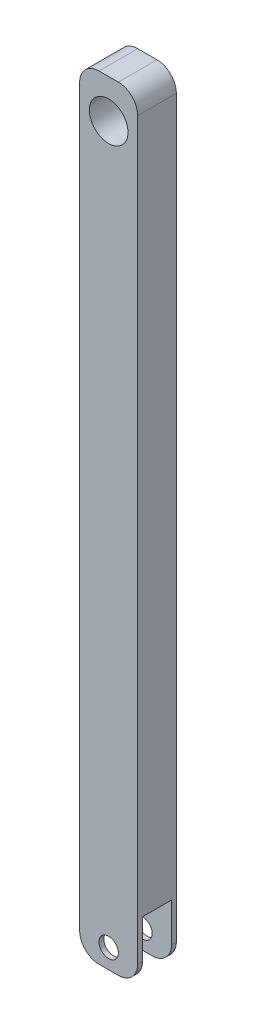
ISO-10303-21;
HEADER;
FILE_DESCRIPTION(('STEP AP214'),'2;1');
FILE_NAME('part.step','',(''),(''),'','','');
FILE_SCHEMA(('AUTOMOTIVE_DESIGN { 1 0 10303 214 1 1 1 1 }'));
ENDSEC;
DATA;
#1=APPLICATION_CONTEXT('core data for automotive mechanical design processes');
#2=APPLICATION_PROTOCOL_DEFINITION('international standard','automotive_design',2000,#1);
#3=PRODUCT_CONTEXT('',#1,'mechanical');
#4=PRODUCT('Part','Part','',(#3));
#5=PRODUCT_RELATED_PRODUCT_CATEGORY('part','',(#4));
#6=PRODUCT_DEFINITION_FORMATION('','',#4);
#7=PRODUCT_DEFINITION_CONTEXT('part definition',#1,'design');
#8=PRODUCT_DEFINITION('design','',#6,#7);
#9=PRODUCT_DEFINITION_SHAPE('','',#8);
#10=(LENGTH_UNIT() NAMED_UNIT(*) SI_UNIT(.MILLI.,.METRE.));
#11=(NAMED_UNIT(*) PLANE_ANGLE_UNIT() SI_UNIT($,.RADIAN.));
#12=(NAMED_UNIT(*) SI_UNIT($,.STERADIAN.) SOLID_ANGLE_UNIT());
#13=UNCERTAINTY_MEASURE_WITH_UNIT(LENGTH_MEASURE(1.E-05),#10,'distance_accuracy_value','');
#14=(GEOMETRIC_REPRESENTATION_CONTEXT(3) GLOBAL_UNCERTAINTY_ASSIGNED_CONTEXT((#13)) GLOBAL_UNIT_ASSIGNED_CONTEXT((#10,
#11,#12)) REPRESENTATION_CONTEXT('',''));
#15=CARTESIAN_POINT('',(0.,0.,0.));
#16=DIRECTION('',(0.,0.,1.));
#17=DIRECTION('',(1.,0.,0.));
#18=AXIS2_PLACEMENT_3D('',#15,#16,#17);
#19=CARTESIAN_POINT('',(0.,1016.,50.8));
#20=DIRECTION('',(1.,0.,0.));
#21=DIRECTION('',(0.,0.,-1.));
#22=AXIS2_PLACEMENT_3D('',#19,#20,#21);
#23=PLANE('',#22);
#24=DIRECTION('',(0.,-1.,0.));
#25=VECTOR('',#24,1.);
#26=CARTESIAN_POINT('',(0.,0.,44.45));
#27=LINE('',#26,#25);
#28=CARTESIAN_POINT('',(0.,76.2,44.45));
#29=VERTEX_POINT('',#28);
#30=CARTESIAN_POINT('',(0.,25.4,44.45));
#31=VERTEX_POINT('',#30);
#32=EDGE_CURVE('E139',#29,#31,#27,.T.);
#33=ORIENTED_EDGE('',*,*,#32,.T.);
#34=DIRECTION('',(0.,0.,1.));
#35=VECTOR('',#34,1.);
#36=CARTESIAN_POINT('',(0.,25.4,50.8));
#37=LINE('',#36,#35);
#38=CARTESIAN_POINT('',(0.,25.4,50.8));
#39=VERTEX_POINT('',#38);
#40=EDGE_CURVE('E298',#31,#39,#37,.T.);
#41=ORIENTED_EDGE('',*,*,#40,.T.);
#42=DIRECTION('',(0.,-1.,0.));
#43=VECTOR('',#42,1.);
#44=CARTESIAN_POINT('',(0.,1016.,50.8));
#45=LINE('',#44,#43);
#46=CARTESIAN_POINT('',(0.,990.6,50.8));
#47=VERTEX_POINT('',#46);
#48=EDGE_CURVE('E226',#47,#39,#45,.T.);
#49=ORIENTED_EDGE('',*,*,#48,.F.);
#50=DIRECTION('',(0.,0.,1.));
#51=VECTOR('',#50,1.);
#52=CARTESIAN_POINT('',(0.,990.6,50.8));
#53=LINE('',#52,#51);
#54=CARTESIAN_POINT('',(0.,990.6,0.));
#55=VERTEX_POINT('',#54);
#56=EDGE_CURVE('E247',#47,#55,#53,.F.);
#57=ORIENTED_EDGE('',*,*,#56,.T.);
#58=DIRECTION('',(0.,-1.,0.));
#59=VECTOR('',#58,1.);
#60=CARTESIAN_POINT('',(0.,1016.,0.));
#61=LINE('',#60,#59);
#62=CARTESIAN_POINT('',(0.,25.4,0.));
#63=VERTEX_POINT('',#62);
#64=EDGE_CURVE('E207',#55,#63,#61,.T.);
#65=ORIENTED_EDGE('',*,*,#64,.T.);
#66=DIRECTION('',(0.,0.,1.));
#67=VECTOR('',#66,1.);
#68=CARTESIAN_POINT('',(0.,25.4,6.35));
#69=LINE('',#68,#67);
#70=CARTESIAN_POINT('',(0.,25.4,6.35));
#71=VERTEX_POINT('',#70);
#72=EDGE_CURVE('E295',#63,#71,#69,.T.);
#73=ORIENTED_EDGE('',*,*,#72,.T.);
#74=DIRECTION('',(0.,1.,0.));
#75=VECTOR('',#74,1.);
#76=CARTESIAN_POINT('',(0.,0.,6.35));
#77=LINE('',#76,#75);
#78=CARTESIAN_POINT('',(0.,76.2,6.35));
#79=VERTEX_POINT('',#78);
#80=EDGE_CURVE('E152',#71,#79,#77,.T.);
#81=ORIENTED_EDGE('',*,*,#80,.T.);
#82=DIRECTION('',(0.,0.,-1.));
#83=VECTOR('',#82,1.);
#84=CARTESIAN_POINT('',(0.,76.2,6.35));
#85=LINE('',#84,#83);
#86=EDGE_CURVE('E160',#29,#79,#85,.T.);
#87=ORIENTED_EDGE('',*,*,#86,.F.);
#88=EDGE_LOOP('',(#33,#41,#49,#57,#65,#73,#81,#87));
#89=FACE_BOUND('',#88,.T.);
#90=ADVANCED_FACE('F38',(#89),#23,.F.);
#91=CARTESIAN_POINT('',(76.2,1016.,0.));
#92=DIRECTION('',(-1.,0.,0.));
#93=DIRECTION('',(0.,0.,1.));
#94=AXIS2_PLACEMENT_3D('',#91,#92,#93);
#95=PLANE('',#94);
#96=DIRECTION('',(0.,-1.,0.));
#97=VECTOR('',#96,1.);
#98=CARTESIAN_POINT('',(76.2,1016.,50.8));
#99=LINE('',#98,#97);
#100=CARTESIAN_POINT('',(76.2,990.6,50.8));
#101=VERTEX_POINT('',#100);
#102=CARTESIAN_POINT('',(76.2,25.4,50.8));
#103=VERTEX_POINT('',#102);
#104=EDGE_CURVE('E222',#101,#103,#99,.T.);
#105=ORIENTED_EDGE('',*,*,#104,.T.);
#106=DIRECTION('',(0.,0.,-1.));
#107=VECTOR('',#106,1.);
#108=CARTESIAN_POINT('',(76.2,25.4,44.45));
#109=LINE('',#108,#107);
#110=CARTESIAN_POINT('',(76.2,25.4,44.45));
#111=VERTEX_POINT('',#110);
#112=EDGE_CURVE('E274',#103,#111,#109,.T.);
#113=ORIENTED_EDGE('',*,*,#112,.T.);
#114=DIRECTION('',(0.,-1.,0.));
#115=VECTOR('',#114,1.);
#116=CARTESIAN_POINT('',(76.2,1016.,44.45));
#117=LINE('',#116,#115);
#118=CARTESIAN_POINT('',(76.2,76.2,44.45));
#119=VERTEX_POINT('',#118);
#120=EDGE_CURVE('E185',#119,#111,#117,.T.);
#121=ORIENTED_EDGE('',*,*,#120,.F.);
#122=DIRECTION('',(0.,0.,-1.));
#123=VECTOR('',#122,1.);
#124=CARTESIAN_POINT('',(76.2,76.2,0.));
#125=LINE('',#124,#123);
#126=CARTESIAN_POINT('',(76.2,76.2,6.35));
#127=VERTEX_POINT('',#126);
#128=EDGE_CURVE('E162',#119,#127,#125,.T.);
#129=ORIENTED_EDGE('',*,*,#128,.T.);
#130=DIRECTION('',(0.,1.,0.));
#131=VECTOR('',#130,1.);
#132=CARTESIAN_POINT('',(76.2,1016.,6.35));
#133=LINE('',#132,#131);
#134=CARTESIAN_POINT('',(76.2,25.4,6.35));
#135=VERTEX_POINT('',#134);
#136=EDGE_CURVE('E181',#135,#127,#133,.T.);
#137=ORIENTED_EDGE('',*,*,#136,.F.);
#138=DIRECTION('',(0.,0.,-1.));
#139=VECTOR('',#138,1.);
#140=CARTESIAN_POINT('',(76.2,25.4,0.));
#141=LINE('',#140,#139);
#142=CARTESIAN_POINT('',(76.2,25.4,0.));
#143=VERTEX_POINT('',#142);
#144=EDGE_CURVE('E270',#135,#143,#141,.T.);
#145=ORIENTED_EDGE('',*,*,#144,.T.);
#146=DIRECTION('',(0.,-1.,0.));
#147=VECTOR('',#146,1.);
#148=CARTESIAN_POINT('',(76.2,1016.,0.));
#149=LINE('',#148,#147);
#150=CARTESIAN_POINT('',(76.2,990.6,0.));
#151=VERTEX_POINT('',#150);
#152=EDGE_CURVE('E218',#151,#143,#149,.T.);
#153=ORIENTED_EDGE('',*,*,#152,.F.);
#154=DIRECTION('',(0.,0.,-1.));
#155=VECTOR('',#154,1.);
#156=CARTESIAN_POINT('',(76.2,990.6,0.));
#157=LINE('',#156,#155);
#158=EDGE_CURVE('E256',#151,#101,#157,.F.);
#159=ORIENTED_EDGE('',*,*,#158,.T.);
#160=EDGE_LOOP('',(#105,#113,#121,#129,#137,#145,#153,#159));
#161=FACE_BOUND('',#160,.T.);
#162=ADVANCED_FACE('F323',(#161),#95,.F.);
#163=CARTESIAN_POINT('',(0.,0.,0.));
#164=DIRECTION('',(0.,-1.,0.));
#165=DIRECTION('',(0.,0.,-1.));
#166=AXIS2_PLACEMENT_3D('',#163,#164,#165);
#167=PLANE('',#166);
#168=DIRECTION('',(-1.,0.,0.));
#169=VECTOR('',#168,1.);
#170=CARTESIAN_POINT('',(254.,0.,44.45));
#171=LINE('',#170,#169);
#172=CARTESIAN_POINT('',(50.8,0.,44.45));
#173=VERTEX_POINT('',#172);
#174=CARTESIAN_POINT('',(25.4,0.,44.45));
#175=VERTEX_POINT('',#174);
#176=EDGE_CURVE('E175',#173,#175,#171,.T.);
#177=ORIENTED_EDGE('',*,*,#176,.F.);
#178=DIRECTION('',(0.,0.,-1.));
#179=VECTOR('',#178,1.);
#180=CARTESIAN_POINT('',(50.8,0.,50.8));
#181=LINE('',#180,#179);
#182=CARTESIAN_POINT('',(50.8,0.,50.8));
#183=VERTEX_POINT('',#182);
#184=EDGE_CURVE('E286',#173,#183,#181,.F.);
#185=ORIENTED_EDGE('',*,*,#184,.T.);
#186=DIRECTION('',(1.,0.,0.));
#187=VECTOR('',#186,1.);
#188=CARTESIAN_POINT('',(76.2,0.,50.8));
#189=LINE('',#188,#187);
#190=CARTESIAN_POINT('',(25.4,0.,50.8));
#191=VERTEX_POINT('',#190);
#192=EDGE_CURVE('E208',#191,#183,#189,.T.);
#193=ORIENTED_EDGE('',*,*,#192,.F.);
#194=DIRECTION('',(0.,0.,1.));
#195=VECTOR('',#194,1.);
#196=CARTESIAN_POINT('',(25.4,0.,44.45));
#197=LINE('',#196,#195);
#198=EDGE_CURVE('E283',#191,#175,#197,.F.);
#199=ORIENTED_EDGE('',*,*,#198,.T.);
#200=EDGE_LOOP('',(#177,#185,#193,#199));
#201=FACE_BOUND('',#200,.T.);
#202=ADVANCED_FACE('F330',(#201),#167,.T.);
#203=DIRECTION('',(-1.,0.,0.));
#204=VECTOR('',#203,1.);
#205=CARTESIAN_POINT('',(0.,0.,0.));
#206=LINE('',#205,#204);
#207=CARTESIAN_POINT('',(50.8,0.,0.));
#208=VERTEX_POINT('',#207);
#209=CARTESIAN_POINT('',(25.4,0.,0.));
#210=VERTEX_POINT('',#209);
#211=EDGE_CURVE('E203',#208,#210,#206,.T.);
#212=ORIENTED_EDGE('',*,*,#211,.F.);
#213=DIRECTION('',(0.,0.,-1.));
#214=VECTOR('',#213,1.);
#215=CARTESIAN_POINT('',(50.8,0.,6.35));
#216=LINE('',#215,#214);
#217=CARTESIAN_POINT('',(50.8,0.,6.35));
#218=VERTEX_POINT('',#217);
#219=EDGE_CURVE('E60',#208,#218,#216,.F.);
#220=ORIENTED_EDGE('',*,*,#219,.T.);
#221=DIRECTION('',(-1.,0.,0.));
#222=VECTOR('',#221,1.);
#223=CARTESIAN_POINT('',(254.,0.,6.35));
#224=LINE('',#223,#222);
#225=CARTESIAN_POINT('',(25.4,0.,6.35));
#226=VERTEX_POINT('',#225);
#227=EDGE_CURVE('E174',#218,#226,#224,.T.);
#228=ORIENTED_EDGE('',*,*,#227,.T.);
#229=DIRECTION('',(0.,0.,1.));
#230=VECTOR('',#229,1.);
#231=CARTESIAN_POINT('',(25.4,0.,0.));
#232=LINE('',#231,#230);
#233=EDGE_CURVE('E307',#226,#210,#232,.F.);
#234=ORIENTED_EDGE('',*,*,#233,.T.);
#235=EDGE_LOOP('',(#212,#220,#228,#234));
#236=FACE_BOUND('',#235,.T.);
#237=ADVANCED_FACE('F313',(#236),#167,.T.);
#238=CARTESIAN_POINT('',(38.1,25.4,-203.2));
#239=DIRECTION('',(0.,0.,1.));
#240=DIRECTION('',(1.,0.,0.));
#241=AXIS2_PLACEMENT_3D('',#238,#239,#240);
#242=CYLINDRICAL_SURFACE('',#241,12.7);
#243=CARTESIAN_POINT('',(38.1,25.4,50.8));
#244=DIRECTION('',(0.,0.,1.));
#245=DIRECTION('',(1.,0.,0.));
#246=AXIS2_PLACEMENT_3D('',#243,#244,#245);
#247=CIRCLE('',#246,12.7);
#248=CARTESIAN_POINT('',(50.8,25.4,50.8));
#249=VERTEX_POINT('',#248);
#250=EDGE_CURVE('E188',#249,#249,#247,.T.);
#251=ORIENTED_EDGE('',*,*,#250,.T.);
#252=EDGE_LOOP('',(#251));
#253=FACE_BOUND('',#252,.T.);
#254=CARTESIAN_POINT('',(38.1,25.4,44.45));
#255=DIRECTION('',(0.,0.,-1.));
#256=DIRECTION('',(-1.,0.,0.));
#257=AXIS2_PLACEMENT_3D('',#254,#255,#256);
#258=CIRCLE('',#257,12.7);
#259=CARTESIAN_POINT('',(25.4,25.4,44.45));
#260=VERTEX_POINT('',#259);
#261=EDGE_CURVE('E184',#260,#260,#258,.F.);
#262=ORIENTED_EDGE('',*,*,#261,.F.);
#263=EDGE_LOOP('',(#262));
#264=FACE_BOUND('',#263,.T.);
#265=ADVANCED_FACE('F392',(#253,#264),#242,.F.);
#266=CARTESIAN_POINT('',(38.1,25.4,0.));
#267=DIRECTION('',(0.,0.,1.));
#268=DIRECTION('',(1.,0.,0.));
#269=AXIS2_PLACEMENT_3D('',#266,#267,#268);
#270=CIRCLE('',#269,12.7);
#271=CARTESIAN_POINT('',(50.8,25.4,0.));
#272=VERTEX_POINT('',#271);
#273=EDGE_CURVE('E192',#272,#272,#270,.T.);
#274=ORIENTED_EDGE('',*,*,#273,.F.);
#275=EDGE_LOOP('',(#274));
#276=FACE_BOUND('',#275,.T.);
#277=CARTESIAN_POINT('',(38.1,25.4,6.34999999999999));
#278=DIRECTION('',(0.,0.,1.));
#279=DIRECTION('',(1.,0.,0.));
#280=AXIS2_PLACEMENT_3D('',#277,#278,#279);
#281=CIRCLE('',#280,12.7);
#282=CARTESIAN_POINT('',(50.8,25.4,6.34999999999999));
#283=VERTEX_POINT('',#282);
#284=EDGE_CURVE('E178',#283,#283,#281,.F.);
#285=ORIENTED_EDGE('',*,*,#284,.F.);
#286=EDGE_LOOP('',(#285));
#287=FACE_BOUND('',#286,.T.);
#288=ADVANCED_FACE('F395',(#276,#287),#242,.F.);
#289=CARTESIAN_POINT('',(76.2,1016.,50.8));
#290=DIRECTION('',(0.,0.,-1.));
#291=DIRECTION('',(-1.,0.,0.));
#292=AXIS2_PLACEMENT_3D('',#289,#290,#291);
#293=PLANE('',#292);
#294=ORIENTED_EDGE('',*,*,#250,.F.);
#295=EDGE_LOOP('',(#294));
#296=FACE_BOUND('',#295,.T.);
#297=CARTESIAN_POINT('',(38.1,965.2,50.8));
#298=DIRECTION('',(0.,0.,1.));
#299=DIRECTION('',(1.,0.,0.));
#300=AXIS2_PLACEMENT_3D('',#297,#298,#299);
#301=CIRCLE('',#300,25.4);
#302=CARTESIAN_POINT('',(63.5,965.2,50.8));
#303=VERTEX_POINT('',#302);
#304=EDGE_CURVE('E193',#303,#303,#301,.T.);
#305=ORIENTED_EDGE('',*,*,#304,.F.);
#306=EDGE_LOOP('',(#305));
#307=FACE_BOUND('',#306,.T.);
#308=ORIENTED_EDGE('',*,*,#192,.T.);
#309=CARTESIAN_POINT('',(50.8,25.4,50.8));
#310=DIRECTION('',(0.,0.,-1.));
#311=DIRECTION('',(-1.,0.,0.));
#312=AXIS2_PLACEMENT_3D('',#309,#310,#311);
#313=CIRCLE('',#312,25.4);
#314=EDGE_CURVE('E292',#183,#103,#313,.F.);
#315=ORIENTED_EDGE('',*,*,#314,.T.);
#316=ORIENTED_EDGE('',*,*,#104,.F.);
#317=CARTESIAN_POINT('',(50.8,990.6,50.8));
#318=DIRECTION('',(0.,0.,-1.));
#319=DIRECTION('',(-1.,0.,0.));
#320=AXIS2_PLACEMENT_3D('',#317,#318,#319);
#321=CIRCLE('',#320,25.4);
#322=CARTESIAN_POINT('',(50.8,1016.,50.8));
#323=VERTEX_POINT('',#322);
#324=EDGE_CURVE('E241',#101,#323,#321,.F.);
#325=ORIENTED_EDGE('',*,*,#324,.T.);
#326=DIRECTION('',(1.,0.,0.));
#327=VECTOR('',#326,1.);
#328=CARTESIAN_POINT('',(76.2,1016.,50.8));
#329=LINE('',#328,#327);
#330=CARTESIAN_POINT('',(25.4,1016.,50.8));
#331=VERTEX_POINT('',#330);
#332=EDGE_CURVE('E198',#331,#323,#329,.T.);
#333=ORIENTED_EDGE('',*,*,#332,.F.);
#334=CARTESIAN_POINT('',(25.4,990.6,50.8));
#335=DIRECTION('',(0.,0.,-1.));
#336=DIRECTION('',(-1.,0.,0.));
#337=AXIS2_PLACEMENT_3D('',#334,#335,#336);
#338=CIRCLE('',#337,25.4);
#339=EDGE_CURVE('E244',#331,#47,#338,.F.);
#340=ORIENTED_EDGE('',*,*,#339,.T.);
#341=ORIENTED_EDGE('',*,*,#48,.T.);
#342=CARTESIAN_POINT('',(25.4,25.4,50.8));
#343=DIRECTION('',(0.,0.,-1.));
#344=DIRECTION('',(-1.,0.,0.));
#345=AXIS2_PLACEMENT_3D('',#342,#343,#344);
#346=CIRCLE('',#345,25.4);
#347=EDGE_CURVE('E289',#39,#191,#346,.F.);
#348=ORIENTED_EDGE('',*,*,#347,.T.);
#349=EDGE_LOOP('',(#308,#315,#316,#325,#333,#340,#341,#348));
#350=FACE_BOUND('',#349,.T.);
#351=ADVANCED_FACE('F337',(#296,#307,#350),#293,.F.);
#352=CARTESIAN_POINT('',(0.,1016.,0.));
#353=DIRECTION('',(0.,0.,1.));
#354=DIRECTION('',(1.,0.,0.));
#355=AXIS2_PLACEMENT_3D('',#352,#353,#354);
#356=PLANE('',#355);
#357=ORIENTED_EDGE('',*,*,#273,.T.);
#358=EDGE_LOOP('',(#357));
#359=FACE_BOUND('',#358,.T.);
#360=CARTESIAN_POINT('',(38.1,965.2,0.));
#361=DIRECTION('',(0.,0.,1.));
#362=DIRECTION('',(1.,0.,0.));
#363=AXIS2_PLACEMENT_3D('',#360,#361,#362);
#364=CIRCLE('',#363,25.4);
#365=CARTESIAN_POINT('',(63.5,965.2,0.));
#366=VERTEX_POINT('',#365);
#367=EDGE_CURVE('E197',#366,#366,#364,.T.);
#368=ORIENTED_EDGE('',*,*,#367,.T.);
#369=EDGE_LOOP('',(#368));
#370=FACE_BOUND('',#369,.T.);
#371=ORIENTED_EDGE('',*,*,#152,.T.);
#372=CARTESIAN_POINT('',(50.8,25.4,0.));
#373=DIRECTION('',(0.,0.,1.));
#374=DIRECTION('',(1.,0.,0.));
#375=AXIS2_PLACEMENT_3D('',#372,#373,#374);
#376=CIRCLE('',#375,25.4);
#377=EDGE_CURVE('E304',#143,#208,#376,.F.);
#378=ORIENTED_EDGE('',*,*,#377,.T.);
#379=ORIENTED_EDGE('',*,*,#211,.T.);
#380=CARTESIAN_POINT('',(25.4,25.4,0.));
#381=DIRECTION('',(0.,0.,1.));
#382=DIRECTION('',(1.,0.,0.));
#383=AXIS2_PLACEMENT_3D('',#380,#381,#382);
#384=CIRCLE('',#383,25.4);
#385=EDGE_CURVE('E301',#210,#63,#384,.F.);
#386=ORIENTED_EDGE('',*,*,#385,.T.);
#387=ORIENTED_EDGE('',*,*,#64,.F.);
#388=CARTESIAN_POINT('',(25.4,990.6,0.));
#389=DIRECTION('',(0.,0.,1.));
#390=DIRECTION('',(1.,0.,0.));
#391=AXIS2_PLACEMENT_3D('',#388,#389,#390);
#392=CIRCLE('',#391,25.4);
#393=CARTESIAN_POINT('',(25.4,1016.,0.));
#394=VERTEX_POINT('',#393);
#395=EDGE_CURVE('E253',#55,#394,#392,.F.);
#396=ORIENTED_EDGE('',*,*,#395,.T.);
#397=DIRECTION('',(-1.,0.,0.));
#398=VECTOR('',#397,1.);
#399=CARTESIAN_POINT('',(0.,1016.,0.));
#400=LINE('',#399,#398);
#401=CARTESIAN_POINT('',(50.8,1016.,0.));
#402=VERTEX_POINT('',#401);
#403=EDGE_CURVE('E202',#402,#394,#400,.T.);
#404=ORIENTED_EDGE('',*,*,#403,.F.);
#405=CARTESIAN_POINT('',(50.8,990.6,0.));
#406=DIRECTION('',(0.,0.,1.));
#407=DIRECTION('',(1.,0.,0.));
#408=AXIS2_PLACEMENT_3D('',#405,#406,#407);
#409=CIRCLE('',#408,25.4);
#410=EDGE_CURVE('E250',#402,#151,#409,.F.);
#411=ORIENTED_EDGE('',*,*,#410,.T.);
#412=EDGE_LOOP('',(#371,#378,#379,#386,#387,#396,#404,#411));
#413=FACE_BOUND('',#412,.T.);
#414=ADVANCED_FACE('F317',(#359,#370,#413),#356,.F.);
#415=CARTESIAN_POINT('',(0.,1016.,0.));
#416=DIRECTION('',(0.,-1.,0.));
#417=DIRECTION('',(0.,0.,-1.));
#418=AXIS2_PLACEMENT_3D('',#415,#416,#417);
#419=PLANE('',#418);
#420=ORIENTED_EDGE('',*,*,#403,.T.);
#421=DIRECTION('',(0.,0.,1.));
#422=VECTOR('',#421,1.);
#423=CARTESIAN_POINT('',(25.4,1016.,0.));
#424=LINE('',#423,#422);
#425=EDGE_CURVE('E237',#394,#331,#424,.T.);
#426=ORIENTED_EDGE('',*,*,#425,.T.);
#427=ORIENTED_EDGE('',*,*,#332,.T.);
#428=DIRECTION('',(0.,0.,-1.));
#429=VECTOR('',#428,1.);
#430=CARTESIAN_POINT('',(50.8,1016.,0.));
#431=LINE('',#430,#429);
#432=EDGE_CURVE('E230',#323,#402,#431,.T.);
#433=ORIENTED_EDGE('',*,*,#432,.T.);
#434=EDGE_LOOP('',(#420,#426,#427,#433));
#435=FACE_BOUND('',#434,.T.);
#436=ADVANCED_FACE('F346',(#435),#419,.F.);
#437=CARTESIAN_POINT('',(38.1,965.2,-965.2));
#438=DIRECTION('',(0.,0.,1.));
#439=DIRECTION('',(1.,0.,0.));
#440=AXIS2_PLACEMENT_3D('',#437,#438,#439);
#441=CYLINDRICAL_SURFACE('',#440,25.4);
#442=ORIENTED_EDGE('',*,*,#304,.T.);
#443=EDGE_LOOP('',(#442));
#444=FACE_BOUND('',#443,.T.);
#445=ORIENTED_EDGE('',*,*,#367,.F.);
#446=EDGE_LOOP('',(#445));
#447=FACE_BOUND('',#446,.T.);
#448=ADVANCED_FACE('F376',(#444,#447),#441,.F.);
#449=CARTESIAN_POINT('',(25.4,990.6,0.));
#450=DIRECTION('',(0.,0.,1.));
#451=DIRECTION('',(1.,0.,0.));
#452=AXIS2_PLACEMENT_3D('',#449,#450,#451);
#453=CYLINDRICAL_SURFACE('',#452,25.4);
#454=ORIENTED_EDGE('',*,*,#395,.F.);
#455=ORIENTED_EDGE('',*,*,#56,.F.);
#456=ORIENTED_EDGE('',*,*,#339,.F.);
#457=ORIENTED_EDGE('',*,*,#425,.F.);
#458=EDGE_LOOP('',(#454,#455,#456,#457));
#459=FACE_BOUND('',#458,.T.);
#460=ADVANCED_FACE('F351',(#459),#453,.T.);
#461=CARTESIAN_POINT('',(50.8,990.6,0.));
#462=DIRECTION('',(0.,0.,-1.));
#463=DIRECTION('',(-1.,0.,0.));
#464=AXIS2_PLACEMENT_3D('',#461,#462,#463);
#465=CYLINDRICAL_SURFACE('',#464,25.4);
#466=ORIENTED_EDGE('',*,*,#324,.F.);
#467=ORIENTED_EDGE('',*,*,#158,.F.);
#468=ORIENTED_EDGE('',*,*,#410,.F.);
#469=ORIENTED_EDGE('',*,*,#432,.F.);
#470=EDGE_LOOP('',(#466,#467,#468,#469));
#471=FACE_BOUND('',#470,.T.);
#472=ADVANCED_FACE('F342',(#471),#465,.T.);
#473=CARTESIAN_POINT('',(254.,0.,44.45));
#474=DIRECTION('',(0.,0.,-1.));
#475=DIRECTION('',(-1.,0.,0.));
#476=AXIS2_PLACEMENT_3D('',#473,#474,#475);
#477=PLANE('',#476);
#478=ORIENTED_EDGE('',*,*,#261,.T.);
#479=EDGE_LOOP('',(#478));
#480=FACE_BOUND('',#479,.T.);
#481=ORIENTED_EDGE('',*,*,#120,.T.);
#482=CARTESIAN_POINT('',(50.8,25.4,44.45));
#483=DIRECTION('',(0.,0.,-1.));
#484=DIRECTION('',(-1.,0.,0.));
#485=AXIS2_PLACEMENT_3D('',#482,#483,#484);
#486=CIRCLE('',#485,25.4);
#487=EDGE_CURVE('E280',#111,#173,#486,.T.);
#488=ORIENTED_EDGE('',*,*,#487,.T.);
#489=ORIENTED_EDGE('',*,*,#176,.T.);
#490=CARTESIAN_POINT('',(25.4,25.4,44.45));
#491=DIRECTION('',(0.,0.,-1.));
#492=DIRECTION('',(-1.,0.,0.));
#493=AXIS2_PLACEMENT_3D('',#490,#491,#492);
#494=CIRCLE('',#493,25.4);
#495=EDGE_CURVE('E146',#175,#31,#494,.T.);
#496=ORIENTED_EDGE('',*,*,#495,.T.);
#497=ORIENTED_EDGE('',*,*,#32,.F.);
#498=DIRECTION('',(-1.,0.,0.));
#499=VECTOR('',#498,1.);
#500=CARTESIAN_POINT('',(254.,76.2,44.45));
#501=LINE('',#500,#499);
#502=EDGE_CURVE('E143',#119,#29,#501,.T.);
#503=ORIENTED_EDGE('',*,*,#502,.F.);
#504=EDGE_LOOP('',(#481,#488,#489,#496,#497,#503));
#505=FACE_BOUND('',#504,.T.);
#506=ADVANCED_FACE('F142',(#480,#505),#477,.T.);
#507=CARTESIAN_POINT('',(254.,0.,6.35));
#508=DIRECTION('',(0.,0.,1.));
#509=DIRECTION('',(1.,0.,0.));
#510=AXIS2_PLACEMENT_3D('',#507,#508,#509);
#511=PLANE('',#510);
#512=ORIENTED_EDGE('',*,*,#284,.T.);
#513=EDGE_LOOP('',(#512));
#514=FACE_BOUND('',#513,.T.);
#515=ORIENTED_EDGE('',*,*,#227,.F.);
#516=CARTESIAN_POINT('',(50.8,25.4,6.35));
#517=DIRECTION('',(0.,0.,1.));
#518=DIRECTION('',(1.,0.,0.));
#519=AXIS2_PLACEMENT_3D('',#516,#517,#518);
#520=CIRCLE('',#519,25.4);
#521=EDGE_CURVE('E11',#218,#135,#520,.T.);
#522=ORIENTED_EDGE('',*,*,#521,.T.);
#523=ORIENTED_EDGE('',*,*,#136,.T.);
#524=DIRECTION('',(-1.,0.,0.));
#525=VECTOR('',#524,1.);
#526=CARTESIAN_POINT('',(254.,76.2,6.35));
#527=LINE('',#526,#525);
#528=EDGE_CURVE('E153',#127,#79,#527,.T.);
#529=ORIENTED_EDGE('',*,*,#528,.T.);
#530=ORIENTED_EDGE('',*,*,#80,.F.);
#531=CARTESIAN_POINT('',(25.4,25.4,6.35));
#532=DIRECTION('',(0.,0.,1.));
#533=DIRECTION('',(1.,0.,0.));
#534=AXIS2_PLACEMENT_3D('',#531,#532,#533);
#535=CIRCLE('',#534,25.4);
#536=EDGE_CURVE('E47',#71,#226,#535,.T.);
#537=ORIENTED_EDGE('',*,*,#536,.T.);
#538=EDGE_LOOP('',(#515,#522,#523,#529,#530,#537));
#539=FACE_BOUND('',#538,.T.);
#540=ADVANCED_FACE('F320',(#514,#539),#511,.T.);
#541=CARTESIAN_POINT('',(254.,76.2,6.35));
#542=DIRECTION('',(0.,1.,0.));
#543=DIRECTION('',(0.,0.,1.));
#544=AXIS2_PLACEMENT_3D('',#541,#542,#543);
#545=PLANE('',#544);
#546=ORIENTED_EDGE('',*,*,#502,.T.);
#547=ORIENTED_EDGE('',*,*,#86,.T.);
#548=ORIENTED_EDGE('',*,*,#528,.F.);
#549=ORIENTED_EDGE('',*,*,#128,.F.);
#550=EDGE_LOOP('',(#546,#547,#548,#549));
#551=FACE_BOUND('',#550,.T.);
#552=ADVANCED_FACE('F158',(#551),#545,.F.);
#553=CARTESIAN_POINT('',(50.8,25.4,0.));
#554=DIRECTION('',(0.,0.,1.));
#555=DIRECTION('',(1.,0.,0.));
#556=AXIS2_PLACEMENT_3D('',#553,#554,#555);
#557=CYLINDRICAL_SURFACE('',#556,25.4);
#558=ORIENTED_EDGE('',*,*,#314,.F.);
#559=ORIENTED_EDGE('',*,*,#184,.F.);
#560=ORIENTED_EDGE('',*,*,#487,.F.);
#561=ORIENTED_EDGE('',*,*,#112,.F.);
#562=EDGE_LOOP('',(#558,#559,#560,#561));
#563=FACE_BOUND('',#562,.T.);
#564=ADVANCED_FACE('F334',(#563),#557,.T.);
#565=CARTESIAN_POINT('',(25.4,25.4,50.8));
#566=DIRECTION('',(0.,0.,-1.));
#567=DIRECTION('',(-1.,0.,0.));
#568=AXIS2_PLACEMENT_3D('',#565,#566,#567);
#569=CYLINDRICAL_SURFACE('',#568,25.4);
#570=ORIENTED_EDGE('',*,*,#495,.F.);
#571=ORIENTED_EDGE('',*,*,#198,.F.);
#572=ORIENTED_EDGE('',*,*,#347,.F.);
#573=ORIENTED_EDGE('',*,*,#40,.F.);
#574=EDGE_LOOP('',(#570,#571,#572,#573));
#575=FACE_BOUND('',#574,.T.);
#576=ADVANCED_FACE('F355',(#575),#569,.T.);
#577=CARTESIAN_POINT('',(50.8,25.4,0.));
#578=DIRECTION('',(0.,0.,1.));
#579=DIRECTION('',(1.,0.,0.));
#580=AXIS2_PLACEMENT_3D('',#577,#578,#579);
#581=CYLINDRICAL_SURFACE('',#580,25.4);
#582=ORIENTED_EDGE('',*,*,#521,.F.);
#583=ORIENTED_EDGE('',*,*,#219,.F.);
#584=ORIENTED_EDGE('',*,*,#377,.F.);
#585=ORIENTED_EDGE('',*,*,#144,.F.);
#586=EDGE_LOOP('',(#582,#583,#584,#585));
#587=FACE_BOUND('',#586,.T.);
#588=ADVANCED_FACE('F357',(#587),#581,.T.);
#589=CARTESIAN_POINT('',(25.4,25.4,50.8));
#590=DIRECTION('',(0.,0.,-1.));
#591=DIRECTION('',(-1.,0.,0.));
#592=AXIS2_PLACEMENT_3D('',#589,#590,#591);
#593=CYLINDRICAL_SURFACE('',#592,25.4);
#594=ORIENTED_EDGE('',*,*,#385,.F.);
#595=ORIENTED_EDGE('',*,*,#233,.F.);
#596=ORIENTED_EDGE('',*,*,#536,.F.);
#597=ORIENTED_EDGE('',*,*,#72,.F.);
#598=EDGE_LOOP('',(#594,#595,#596,#597));
#599=FACE_BOUND('',#598,.T.);
#600=ADVANCED_FACE('F40',(#599),#593,.T.);
#601=CLOSED_SHELL('',(#90,#162,#202,#237,#265,#288,#351,#414,#436,#448,#460,#472,#506,#540,#552,
#564,#576,#588,#600));
#602=MANIFOLD_SOLID_BREP('B2',#601);
#603=ADVANCED_BREP_SHAPE_REPRESENTATION('',(#18,#602),#14);
#604=SHAPE_DEFINITION_REPRESENTATION(#9,#603);
ENDSEC;
END-ISO-10303-21;
